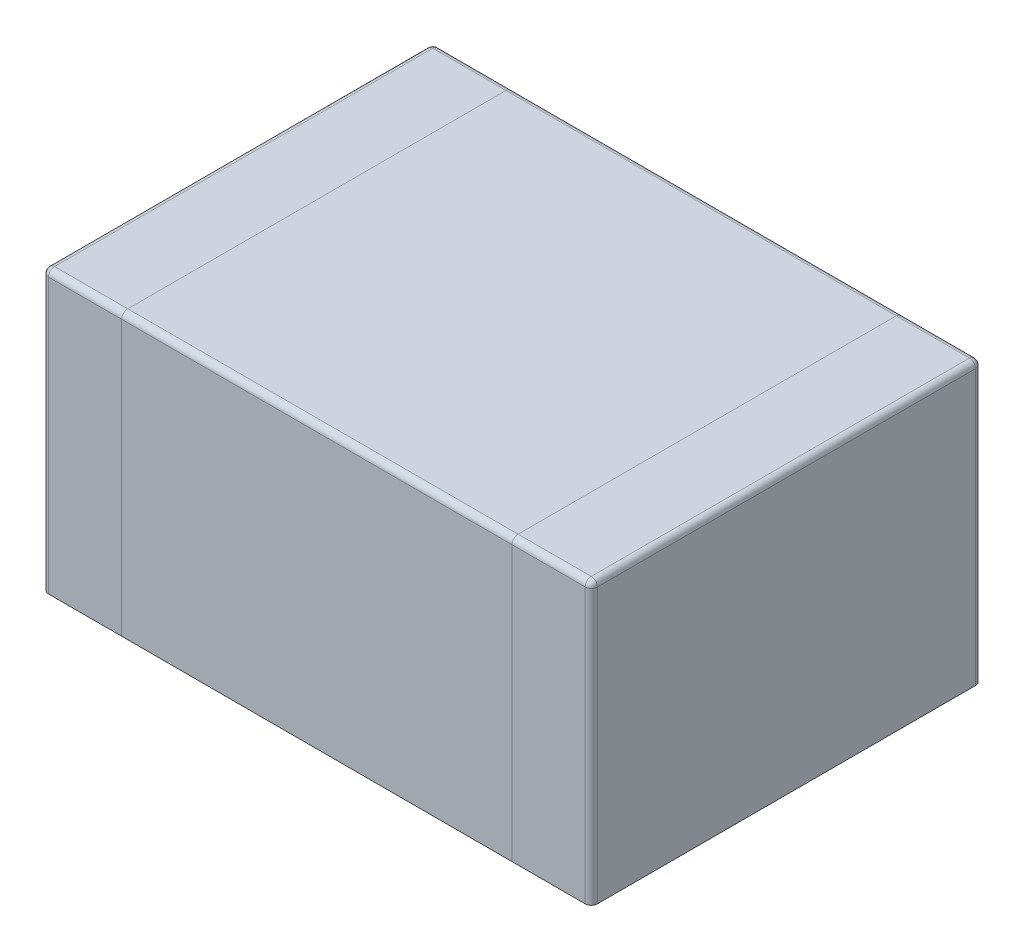
ISO-10303-21;
HEADER;
FILE_DESCRIPTION(('STEP AP214'),'2;1');
FILE_NAME('part.step','',(''),(''),'','','');
FILE_SCHEMA(('AUTOMOTIVE_DESIGN { 1 0 10303 214 1 1 1 1 }'));
ENDSEC;
DATA;
#1=APPLICATION_CONTEXT('core data for automotive mechanical design processes');
#2=APPLICATION_PROTOCOL_DEFINITION('international standard','automotive_design',2000,#1);
#3=PRODUCT_CONTEXT('',#1,'mechanical');
#4=PRODUCT('Part','Part','',(#3));
#5=PRODUCT_RELATED_PRODUCT_CATEGORY('part','',(#4));
#6=PRODUCT_DEFINITION_FORMATION('','',#4);
#7=PRODUCT_DEFINITION_CONTEXT('part definition',#1,'design');
#8=PRODUCT_DEFINITION('design','',#6,#7);
#9=PRODUCT_DEFINITION_SHAPE('','',#8);
#10=(LENGTH_UNIT() NAMED_UNIT(*) SI_UNIT(.MILLI.,.METRE.));
#11=(NAMED_UNIT(*) PLANE_ANGLE_UNIT() SI_UNIT($,.RADIAN.));
#12=(NAMED_UNIT(*) SI_UNIT($,.STERADIAN.) SOLID_ANGLE_UNIT());
#13=UNCERTAINTY_MEASURE_WITH_UNIT(LENGTH_MEASURE(1.E-05),#10,'distance_accuracy_value','');
#14=(GEOMETRIC_REPRESENTATION_CONTEXT(3) GLOBAL_UNCERTAINTY_ASSIGNED_CONTEXT((#13)) GLOBAL_UNIT_ASSIGNED_CONTEXT((#10,
#11,#12)) REPRESENTATION_CONTEXT('',''));
#15=CARTESIAN_POINT('',(0.,0.,0.));
#16=DIRECTION('',(0.,0.,1.));
#17=DIRECTION('',(1.,0.,0.));
#18=AXIS2_PLACEMENT_3D('',#15,#16,#17);
#19=CARTESIAN_POINT('',(-1.6,0.,-1.6));
#20=DIRECTION('',(-1.,0.,0.));
#21=DIRECTION('',(0.,0.,1.));
#22=AXIS2_PLACEMENT_3D('',#19,#20,#21);
#23=PLANE('',#22);
#24=DIRECTION('',(0.,0.,1.));
#25=VECTOR('',#24,1.);
#26=CARTESIAN_POINT('',(-1.6,2.3,-1.6));
#27=LINE('',#26,#25);
#28=CARTESIAN_POINT('',(-1.6,2.3,-1.55));
#29=VERTEX_POINT('',#28);
#30=CARTESIAN_POINT('',(-1.6,2.3,1.55));
#31=VERTEX_POINT('',#30);
#32=EDGE_CURVE('E131',#29,#31,#27,.T.);
#33=ORIENTED_EDGE('',*,*,#32,.F.);
#34=CARTESIAN_POINT('',(-1.6,2.25,-1.55));
#35=DIRECTION('',(-1.,0.,0.));
#36=DIRECTION('',(0.,0.,1.));
#37=AXIS2_PLACEMENT_3D('',#34,#35,#36);
#38=CIRCLE('',#37,0.05);
#39=CARTESIAN_POINT('',(-1.6,2.25,-1.6));
#40=VERTEX_POINT('',#39);
#41=EDGE_CURVE('E150',#29,#40,#38,.T.);
#42=ORIENTED_EDGE('',*,*,#41,.T.);
#43=DIRECTION('',(0.,1.,0.));
#44=VECTOR('',#43,1.);
#45=CARTESIAN_POINT('',(-1.6,0.,-1.6));
#46=LINE('',#45,#44);
#47=CARTESIAN_POINT('',(-1.6,0.,-1.6));
#48=VERTEX_POINT('',#47);
#49=EDGE_CURVE('E127',#48,#40,#46,.T.);
#50=ORIENTED_EDGE('',*,*,#49,.F.);
#51=DIRECTION('',(0.,0.,1.));
#52=VECTOR('',#51,1.);
#53=CARTESIAN_POINT('',(-1.6,0.,-1.6));
#54=LINE('',#53,#52);
#55=CARTESIAN_POINT('',(-1.6,0.,1.6));
#56=VERTEX_POINT('',#55);
#57=EDGE_CURVE('E121',#48,#56,#54,.T.);
#58=ORIENTED_EDGE('',*,*,#57,.T.);
#59=DIRECTION('',(0.,1.,0.));
#60=VECTOR('',#59,1.);
#61=CARTESIAN_POINT('',(-1.6,0.,1.6));
#62=LINE('',#61,#60);
#63=CARTESIAN_POINT('',(-1.6,2.25,1.6));
#64=VERTEX_POINT('',#63);
#65=EDGE_CURVE('E105',#56,#64,#62,.T.);
#66=ORIENTED_EDGE('',*,*,#65,.T.);
#67=CARTESIAN_POINT('',(-1.6,2.25,1.55));
#68=DIRECTION('',(-1.,0.,0.));
#69=DIRECTION('',(0.,0.,1.));
#70=AXIS2_PLACEMENT_3D('',#67,#68,#69);
#71=CIRCLE('',#70,0.05);
#72=EDGE_CURVE('E148',#64,#31,#71,.T.);
#73=ORIENTED_EDGE('',*,*,#72,.T.);
#74=EDGE_LOOP('',(#33,#42,#50,#58,#66,#73));
#75=FACE_BOUND('',#74,.T.);
#76=ADVANCED_FACE('F52',(#75),#23,.T.);
#77=CARTESIAN_POINT('',(-1.6,0.,-1.6));
#78=DIRECTION('',(0.,0.,-1.));
#79=DIRECTION('',(-1.,0.,0.));
#80=AXIS2_PLACEMENT_3D('',#77,#78,#79);
#81=PLANE('',#80);
#82=ORIENTED_EDGE('',*,*,#49,.T.);
#83=DIRECTION('',(-1.,0.,0.));
#84=VECTOR('',#83,1.);
#85=CARTESIAN_POINT('',(-1.6,2.25,-1.6));
#86=LINE('',#85,#84);
#87=CARTESIAN_POINT('',(1.6,2.25,-1.6));
#88=VERTEX_POINT('',#87);
#89=EDGE_CURVE('E75',#40,#88,#86,.F.);
#90=ORIENTED_EDGE('',*,*,#89,.T.);
#91=DIRECTION('',(0.,1.,0.));
#92=VECTOR('',#91,1.);
#93=CARTESIAN_POINT('',(1.6,0.,-1.6));
#94=LINE('',#93,#92);
#95=CARTESIAN_POINT('',(1.6,0.,-1.6));
#96=VERTEX_POINT('',#95);
#97=EDGE_CURVE('E140',#96,#88,#94,.T.);
#98=ORIENTED_EDGE('',*,*,#97,.F.);
#99=DIRECTION('',(-1.,0.,0.));
#100=VECTOR('',#99,1.);
#101=CARTESIAN_POINT('',(-1.6,0.,-1.6));
#102=LINE('',#101,#100);
#103=EDGE_CURVE('E114',#96,#48,#102,.T.);
#104=ORIENTED_EDGE('',*,*,#103,.T.);
#105=EDGE_LOOP('',(#82,#90,#98,#104));
#106=FACE_BOUND('',#105,.T.);
#107=ADVANCED_FACE('F161',(#106),#81,.T.);
#108=CARTESIAN_POINT('',(1.6,0.,-1.6));
#109=DIRECTION('',(1.,0.,0.));
#110=DIRECTION('',(0.,0.,-1.));
#111=AXIS2_PLACEMENT_3D('',#108,#109,#110);
#112=PLANE('',#111);
#113=ORIENTED_EDGE('',*,*,#97,.T.);
#114=CARTESIAN_POINT('',(1.6,2.25,-1.55));
#115=DIRECTION('',(1.,0.,0.));
#116=DIRECTION('',(0.,0.,-1.));
#117=AXIS2_PLACEMENT_3D('',#114,#115,#116);
#118=CIRCLE('',#117,0.05);
#119=CARTESIAN_POINT('',(1.6,2.3,-1.55));
#120=VERTEX_POINT('',#119);
#121=EDGE_CURVE('E60',#88,#120,#118,.T.);
#122=ORIENTED_EDGE('',*,*,#121,.T.);
#123=DIRECTION('',(0.,0.,-1.));
#124=VECTOR('',#123,1.);
#125=CARTESIAN_POINT('',(1.6,2.3,-1.6));
#126=LINE('',#125,#124);
#127=CARTESIAN_POINT('',(1.6,2.3,1.55));
#128=VERTEX_POINT('',#127);
#129=EDGE_CURVE('E128',#128,#120,#126,.T.);
#130=ORIENTED_EDGE('',*,*,#129,.F.);
#131=CARTESIAN_POINT('',(1.6,2.25,1.55));
#132=DIRECTION('',(1.,0.,0.));
#133=DIRECTION('',(0.,0.,-1.));
#134=AXIS2_PLACEMENT_3D('',#131,#132,#133);
#135=CIRCLE('',#134,0.05);
#136=CARTESIAN_POINT('',(1.6,2.25,1.6));
#137=VERTEX_POINT('',#136);
#138=EDGE_CURVE('E67',#128,#137,#135,.T.);
#139=ORIENTED_EDGE('',*,*,#138,.T.);
#140=DIRECTION('',(0.,1.,0.));
#141=VECTOR('',#140,1.);
#142=CARTESIAN_POINT('',(1.6,0.,1.6));
#143=LINE('',#142,#141);
#144=CARTESIAN_POINT('',(1.6,0.,1.6));
#145=VERTEX_POINT('',#144);
#146=EDGE_CURVE('E113',#145,#137,#143,.T.);
#147=ORIENTED_EDGE('',*,*,#146,.F.);
#148=DIRECTION('',(0.,0.,-1.));
#149=VECTOR('',#148,1.);
#150=CARTESIAN_POINT('',(1.6,0.,-1.6));
#151=LINE('',#150,#149);
#152=EDGE_CURVE('E124',#145,#96,#151,.T.);
#153=ORIENTED_EDGE('',*,*,#152,.T.);
#154=EDGE_LOOP('',(#113,#122,#130,#139,#147,#153));
#155=FACE_BOUND('',#154,.T.);
#156=ADVANCED_FACE('F154',(#155),#112,.T.);
#157=CARTESIAN_POINT('',(-1.6,0.,1.6));
#158=DIRECTION('',(0.,0.,1.));
#159=DIRECTION('',(1.,0.,0.));
#160=AXIS2_PLACEMENT_3D('',#157,#158,#159);
#161=PLANE('',#160);
#162=ORIENTED_EDGE('',*,*,#146,.T.);
#163=DIRECTION('',(1.,0.,0.));
#164=VECTOR('',#163,1.);
#165=CARTESIAN_POINT('',(-1.6,2.25,1.6));
#166=LINE('',#165,#164);
#167=EDGE_CURVE('E12',#137,#64,#166,.F.);
#168=ORIENTED_EDGE('',*,*,#167,.T.);
#169=ORIENTED_EDGE('',*,*,#65,.F.);
#170=DIRECTION('',(1.,0.,0.));
#171=VECTOR('',#170,1.);
#172=CARTESIAN_POINT('',(-1.6,0.,1.6));
#173=LINE('',#172,#171);
#174=EDGE_CURVE('E108',#56,#145,#173,.T.);
#175=ORIENTED_EDGE('',*,*,#174,.T.);
#176=EDGE_LOOP('',(#162,#168,#169,#175));
#177=FACE_BOUND('',#176,.T.);
#178=ADVANCED_FACE('F107',(#177),#161,.T.);
#179=CARTESIAN_POINT('',(0.,0.,0.));
#180=DIRECTION('',(0.,1.,0.));
#181=DIRECTION('',(0.,0.,1.));
#182=AXIS2_PLACEMENT_3D('',#179,#180,#181);
#183=PLANE('',#182);
#184=ORIENTED_EDGE('',*,*,#57,.F.);
#185=ORIENTED_EDGE('',*,*,#103,.F.);
#186=ORIENTED_EDGE('',*,*,#152,.F.);
#187=ORIENTED_EDGE('',*,*,#174,.F.);
#188=EDGE_LOOP('',(#184,#185,#186,#187));
#189=FACE_BOUND('',#188,.T.);
#190=ADVANCED_FACE('F119',(#189),#183,.F.);
#191=CARTESIAN_POINT('',(0.,2.3,0.));
#192=DIRECTION('',(0.,1.,0.));
#193=DIRECTION('',(0.,0.,1.));
#194=AXIS2_PLACEMENT_3D('',#191,#192,#193);
#195=PLANE('',#194);
#196=ORIENTED_EDGE('',*,*,#129,.T.);
#197=DIRECTION('',(-1.,0.,0.));
#198=VECTOR('',#197,1.);
#199=CARTESIAN_POINT('',(0.,2.3,-1.55));
#200=LINE('',#199,#198);
#201=EDGE_CURVE('E145',#120,#29,#200,.T.);
#202=ORIENTED_EDGE('',*,*,#201,.T.);
#203=ORIENTED_EDGE('',*,*,#32,.T.);
#204=DIRECTION('',(1.,0.,0.));
#205=VECTOR('',#204,1.);
#206=CARTESIAN_POINT('',(0.,2.3,1.55));
#207=LINE('',#206,#205);
#208=EDGE_CURVE('E139',#31,#128,#207,.T.);
#209=ORIENTED_EDGE('',*,*,#208,.T.);
#210=EDGE_LOOP('',(#196,#202,#203,#209));
#211=FACE_BOUND('',#210,.T.);
#212=ADVANCED_FACE('F158',(#211),#195,.T.);
#213=CARTESIAN_POINT('',(0.,2.25,-1.55));
#214=DIRECTION('',(-1.,0.,0.));
#215=DIRECTION('',(0.,0.,1.));
#216=AXIS2_PLACEMENT_3D('',#213,#214,#215);
#217=CYLINDRICAL_SURFACE('',#216,0.05);
#218=ORIENTED_EDGE('',*,*,#121,.F.);
#219=ORIENTED_EDGE('',*,*,#89,.F.);
#220=ORIENTED_EDGE('',*,*,#41,.F.);
#221=ORIENTED_EDGE('',*,*,#201,.F.);
#222=EDGE_LOOP('',(#218,#219,#220,#221));
#223=FACE_BOUND('',#222,.T.);
#224=ADVANCED_FACE('F160',(#223),#217,.T.);
#225=CARTESIAN_POINT('',(0.,2.25,1.55));
#226=DIRECTION('',(1.,0.,0.));
#227=DIRECTION('',(0.,0.,-1.));
#228=AXIS2_PLACEMENT_3D('',#225,#226,#227);
#229=CYLINDRICAL_SURFACE('',#228,0.05);
#230=ORIENTED_EDGE('',*,*,#72,.F.);
#231=ORIENTED_EDGE('',*,*,#167,.F.);
#232=ORIENTED_EDGE('',*,*,#138,.F.);
#233=ORIENTED_EDGE('',*,*,#208,.F.);
#234=EDGE_LOOP('',(#230,#231,#232,#233));
#235=FACE_BOUND('',#234,.T.);
#236=ADVANCED_FACE('F54',(#235),#229,.T.);
#237=CLOSED_SHELL('',(#76,#107,#156,#178,#190,#212,#224,#236));
#238=MANIFOLD_SOLID_BREP('B2',#237);
#239=CARTESIAN_POINT('',(0.,2.3,-1.6));
#240=DIRECTION('',(0.,0.,1.));
#241=DIRECTION('',(1.,0.,0.));
#242=AXIS2_PLACEMENT_3D('',#239,#240,#241);
#243=PLANE('',#242);
#244=DIRECTION('',(0.,-1.,0.));
#245=VECTOR('',#244,1.);
#246=CARTESIAN_POINT('',(1.6,2.3,-1.6));
#247=LINE('',#246,#245);
#248=CARTESIAN_POINT('',(1.6,2.25,-1.6));
#249=VERTEX_POINT('',#248);
#250=CARTESIAN_POINT('',(1.6,0.,-1.6));
#251=VERTEX_POINT('',#250);
#252=EDGE_CURVE('E304',#249,#251,#247,.T.);
#253=ORIENTED_EDGE('',*,*,#252,.F.);
#254=DIRECTION('',(-1.,0.,0.));
#255=VECTOR('',#254,1.);
#256=CARTESIAN_POINT('',(2.25,2.25,-1.6));
#257=LINE('',#256,#255);
#258=CARTESIAN_POINT('',(2.2,2.25,-1.6));
#259=VERTEX_POINT('',#258);
#260=EDGE_CURVE('E345',#249,#259,#257,.F.);
#261=ORIENTED_EDGE('',*,*,#260,.T.);
#262=DIRECTION('',(0.,-1.,0.));
#263=VECTOR('',#262,1.);
#264=CARTESIAN_POINT('',(2.2,0.,-1.6));
#265=LINE('',#264,#263);
#266=CARTESIAN_POINT('',(2.2,0.,-1.6));
#267=VERTEX_POINT('',#266);
#268=EDGE_CURVE('E307',#259,#267,#265,.T.);
#269=ORIENTED_EDGE('',*,*,#268,.T.);
#270=DIRECTION('',(-1.,0.,0.));
#271=VECTOR('',#270,1.);
#272=CARTESIAN_POINT('',(0.,0.,-1.6));
#273=LINE('',#272,#271);
#274=EDGE_CURVE('E302',#267,#251,#273,.T.);
#275=ORIENTED_EDGE('',*,*,#274,.T.);
#276=EDGE_LOOP('',(#253,#261,#269,#275));
#277=FACE_BOUND('',#276,.T.);
#278=ADVANCED_FACE('F237',(#277),#243,.F.);
#279=CARTESIAN_POINT('',(1.6,2.3,0.));
#280=DIRECTION('',(1.,0.,0.));
#281=DIRECTION('',(0.,0.,-1.));
#282=AXIS2_PLACEMENT_3D('',#279,#280,#281);
#283=PLANE('',#282);
#284=DIRECTION('',(0.,0.,1.));
#285=VECTOR('',#284,1.);
#286=CARTESIAN_POINT('',(1.6,2.3,0.));
#287=LINE('',#286,#285);
#288=CARTESIAN_POINT('',(1.6,2.3,-1.55));
#289=VERTEX_POINT('',#288);
#290=CARTESIAN_POINT('',(1.6,2.3,1.55));
#291=VERTEX_POINT('',#290);
#292=EDGE_CURVE('E333',#289,#291,#287,.T.);
#293=ORIENTED_EDGE('',*,*,#292,.F.);
#294=CARTESIAN_POINT('',(1.6,2.25,-1.55));
#295=DIRECTION('',(1.,0.,0.));
#296=DIRECTION('',(0.,0.,-1.));
#297=AXIS2_PLACEMENT_3D('',#294,#295,#296);
#298=CIRCLE('',#297,0.05);
#299=EDGE_CURVE('E318',#289,#249,#298,.F.);
#300=ORIENTED_EDGE('',*,*,#299,.T.);
#301=ORIENTED_EDGE('',*,*,#252,.T.);
#302=DIRECTION('',(0.,0.,1.));
#303=VECTOR('',#302,1.);
#304=CARTESIAN_POINT('',(1.6,0.,0.));
#305=LINE('',#304,#303);
#306=CARTESIAN_POINT('',(1.6,0.,1.6));
#307=VERTEX_POINT('',#306);
#308=EDGE_CURVE('E311',#251,#307,#305,.T.);
#309=ORIENTED_EDGE('',*,*,#308,.T.);
#310=DIRECTION('',(0.,-1.,0.));
#311=VECTOR('',#310,1.);
#312=CARTESIAN_POINT('',(1.6,2.3,1.6));
#313=LINE('',#312,#311);
#314=CARTESIAN_POINT('',(1.6,2.25,1.6));
#315=VERTEX_POINT('',#314);
#316=EDGE_CURVE('E320',#315,#307,#313,.T.);
#317=ORIENTED_EDGE('',*,*,#316,.F.);
#318=CARTESIAN_POINT('',(1.6,2.25,1.55));
#319=DIRECTION('',(1.,0.,0.));
#320=DIRECTION('',(0.,0.,-1.));
#321=AXIS2_PLACEMENT_3D('',#318,#319,#320);
#322=CIRCLE('',#321,0.05);
#323=EDGE_CURVE('E341',#315,#291,#322,.F.);
#324=ORIENTED_EDGE('',*,*,#323,.T.);
#325=EDGE_LOOP('',(#293,#300,#301,#309,#317,#324));
#326=FACE_BOUND('',#325,.T.);
#327=ADVANCED_FACE('F316',(#326),#283,.F.);
#328=CARTESIAN_POINT('',(0.,2.3,1.6));
#329=DIRECTION('',(0.,0.,1.));
#330=DIRECTION('',(1.,0.,0.));
#331=AXIS2_PLACEMENT_3D('',#328,#329,#330);
#332=PLANE('',#331);
#333=DIRECTION('',(0.,-1.,0.));
#334=VECTOR('',#333,1.);
#335=CARTESIAN_POINT('',(2.2,2.3,1.6));
#336=LINE('',#335,#334);
#337=CARTESIAN_POINT('',(2.2,0.,1.6));
#338=VERTEX_POINT('',#337);
#339=CARTESIAN_POINT('',(2.2,2.25,1.6));
#340=VERTEX_POINT('',#339);
#341=EDGE_CURVE('E347',#338,#340,#336,.F.);
#342=ORIENTED_EDGE('',*,*,#341,.T.);
#343=DIRECTION('',(-1.,0.,0.));
#344=VECTOR('',#343,1.);
#345=CARTESIAN_POINT('',(0.,2.25,1.6));
#346=LINE('',#345,#344);
#347=EDGE_CURVE('E349',#340,#315,#346,.T.);
#348=ORIENTED_EDGE('',*,*,#347,.T.);
#349=ORIENTED_EDGE('',*,*,#316,.T.);
#350=DIRECTION('',(-1.,0.,0.));
#351=VECTOR('',#350,1.);
#352=CARTESIAN_POINT('',(0.,0.,1.6));
#353=LINE('',#352,#351);
#354=EDGE_CURVE('E325',#338,#307,#353,.T.);
#355=ORIENTED_EDGE('',*,*,#354,.F.);
#356=EDGE_LOOP('',(#342,#348,#349,#355));
#357=FACE_BOUND('',#356,.T.);
#358=ADVANCED_FACE('F393',(#357),#332,.T.);
#359=CARTESIAN_POINT('',(2.25,2.3,0.));
#360=DIRECTION('',(1.,0.,0.));
#361=DIRECTION('',(0.,0.,-1.));
#362=AXIS2_PLACEMENT_3D('',#359,#360,#361);
#363=PLANE('',#362);
#364=DIRECTION('',(0.,0.,1.));
#365=VECTOR('',#364,1.);
#366=CARTESIAN_POINT('',(2.25,2.25,0.));
#367=LINE('',#366,#365);
#368=CARTESIAN_POINT('',(2.25,2.25,-1.55));
#369=VERTEX_POINT('',#368);
#370=CARTESIAN_POINT('',(2.25,2.25,1.55));
#371=VERTEX_POINT('',#370);
#372=EDGE_CURVE('E254',#369,#371,#367,.T.);
#373=ORIENTED_EDGE('',*,*,#372,.T.);
#374=DIRECTION('',(0.,-1.,0.));
#375=VECTOR('',#374,1.);
#376=CARTESIAN_POINT('',(2.25,2.3,1.55));
#377=LINE('',#376,#375);
#378=CARTESIAN_POINT('',(2.25,0.,1.55));
#379=VERTEX_POINT('',#378);
#380=EDGE_CURVE('E353',#371,#379,#377,.T.);
#381=ORIENTED_EDGE('',*,*,#380,.T.);
#382=DIRECTION('',(0.,0.,1.));
#383=VECTOR('',#382,1.);
#384=CARTESIAN_POINT('',(2.25,0.,0.));
#385=LINE('',#384,#383);
#386=CARTESIAN_POINT('',(2.25,0.,-1.55));
#387=VERTEX_POINT('',#386);
#388=EDGE_CURVE('E328',#387,#379,#385,.T.);
#389=ORIENTED_EDGE('',*,*,#388,.F.);
#390=DIRECTION('',(0.,-1.,0.));
#391=VECTOR('',#390,1.);
#392=CARTESIAN_POINT('',(2.25,2.3,-1.55));
#393=LINE('',#392,#391);
#394=EDGE_CURVE('E259',#387,#369,#393,.F.);
#395=ORIENTED_EDGE('',*,*,#394,.T.);
#396=EDGE_LOOP('',(#373,#381,#389,#395));
#397=FACE_BOUND('',#396,.T.);
#398=ADVANCED_FACE('F395',(#397),#363,.T.);
#399=CARTESIAN_POINT('',(0.,2.3,0.));
#400=DIRECTION('',(0.,1.,0.));
#401=DIRECTION('',(0.,0.,1.));
#402=AXIS2_PLACEMENT_3D('',#399,#400,#401);
#403=PLANE('',#402);
#404=DIRECTION('',(0.,0.,1.));
#405=VECTOR('',#404,1.);
#406=CARTESIAN_POINT('',(2.2,2.3,0.));
#407=LINE('',#406,#405);
#408=CARTESIAN_POINT('',(2.2,2.3,1.55));
#409=VERTEX_POINT('',#408);
#410=CARTESIAN_POINT('',(2.2,2.3,-1.55));
#411=VERTEX_POINT('',#410);
#412=EDGE_CURVE('E319',#409,#411,#407,.F.);
#413=ORIENTED_EDGE('',*,*,#412,.T.);
#414=DIRECTION('',(-1.,0.,0.));
#415=VECTOR('',#414,1.);
#416=CARTESIAN_POINT('',(1.6,2.3,-1.55));
#417=LINE('',#416,#415);
#418=EDGE_CURVE('E338',#411,#289,#417,.T.);
#419=ORIENTED_EDGE('',*,*,#418,.T.);
#420=ORIENTED_EDGE('',*,*,#292,.T.);
#421=DIRECTION('',(-1.,0.,0.));
#422=VECTOR('',#421,1.);
#423=CARTESIAN_POINT('',(0.,2.3,1.55));
#424=LINE('',#423,#422);
#425=EDGE_CURVE('E336',#291,#409,#424,.F.);
#426=ORIENTED_EDGE('',*,*,#425,.T.);
#427=EDGE_LOOP('',(#413,#419,#420,#426));
#428=FACE_BOUND('',#427,.T.);
#429=ADVANCED_FACE('F384',(#428),#403,.T.);
#430=CARTESIAN_POINT('',(0.,0.,0.));
#431=DIRECTION('',(0.,1.,0.));
#432=DIRECTION('',(0.,0.,1.));
#433=AXIS2_PLACEMENT_3D('',#430,#431,#432);
#434=PLANE('',#433);
#435=ORIENTED_EDGE('',*,*,#388,.T.);
#436=CARTESIAN_POINT('',(2.2,0.,1.55));
#437=DIRECTION('',(0.,1.,0.));
#438=DIRECTION('',(0.,0.,1.));
#439=AXIS2_PLACEMENT_3D('',#436,#437,#438);
#440=CIRCLE('',#439,0.05);
#441=EDGE_CURVE('E50',#379,#338,#440,.F.);
#442=ORIENTED_EDGE('',*,*,#441,.T.);
#443=ORIENTED_EDGE('',*,*,#354,.T.);
#444=ORIENTED_EDGE('',*,*,#308,.F.);
#445=ORIENTED_EDGE('',*,*,#274,.F.);
#446=CARTESIAN_POINT('',(2.2,0.,-1.55));
#447=DIRECTION('',(0.,1.,0.));
#448=DIRECTION('',(0.,0.,1.));
#449=AXIS2_PLACEMENT_3D('',#446,#447,#448);
#450=CIRCLE('',#449,0.05);
#451=EDGE_CURVE('E246',#267,#387,#450,.F.);
#452=ORIENTED_EDGE('',*,*,#451,.T.);
#453=EDGE_LOOP('',(#435,#442,#443,#444,#445,#452));
#454=FACE_BOUND('',#453,.T.);
#455=ADVANCED_FACE('F323',(#454),#434,.F.);
#456=CARTESIAN_POINT('',(2.2,2.3,1.55));
#457=DIRECTION('',(0.,-1.,0.));
#458=DIRECTION('',(0.,0.,-1.));
#459=AXIS2_PLACEMENT_3D('',#456,#457,#458);
#460=CYLINDRICAL_SURFACE('',#459,0.05);
#461=ORIENTED_EDGE('',*,*,#441,.F.);
#462=ORIENTED_EDGE('',*,*,#380,.F.);
#463=CARTESIAN_POINT('',(2.2,2.25,1.55));
#464=DIRECTION('',(0.,1.,0.));
#465=DIRECTION('',(0.,0.,1.));
#466=AXIS2_PLACEMENT_3D('',#463,#464,#465);
#467=CIRCLE('',#466,0.05);
#468=EDGE_CURVE('E241',#340,#371,#467,.T.);
#469=ORIENTED_EDGE('',*,*,#468,.F.);
#470=ORIENTED_EDGE('',*,*,#341,.F.);
#471=EDGE_LOOP('',(#461,#462,#469,#470));
#472=FACE_BOUND('',#471,.T.);
#473=ADVANCED_FACE('F239',(#472),#460,.T.);
#474=CARTESIAN_POINT('',(0.,2.25,1.55));
#475=DIRECTION('',(-1.,0.,0.));
#476=DIRECTION('',(0.,0.,1.));
#477=AXIS2_PLACEMENT_3D('',#474,#475,#476);
#478=CYLINDRICAL_SURFACE('',#477,0.05);
#479=ORIENTED_EDGE('',*,*,#323,.F.);
#480=ORIENTED_EDGE('',*,*,#347,.F.);
#481=CARTESIAN_POINT('',(2.2,2.25,1.55));
#482=DIRECTION('',(1.,0.,0.));
#483=DIRECTION('',(0.,0.,-1.));
#484=AXIS2_PLACEMENT_3D('',#481,#482,#483);
#485=CIRCLE('',#484,0.05);
#486=EDGE_CURVE('E367',#409,#340,#485,.T.);
#487=ORIENTED_EDGE('',*,*,#486,.F.);
#488=ORIENTED_EDGE('',*,*,#425,.F.);
#489=EDGE_LOOP('',(#479,#480,#487,#488));
#490=FACE_BOUND('',#489,.T.);
#491=ADVANCED_FACE('F391',(#490),#478,.T.);
#492=CARTESIAN_POINT('',(2.2,2.25,1.55));
#493=DIRECTION('',(0.,0.,1.));
#494=DIRECTION('',(1.,0.,0.));
#495=AXIS2_PLACEMENT_3D('',#492,#493,#494);
#496=SPHERICAL_SURFACE('',#495,0.05);
#497=ORIENTED_EDGE('',*,*,#486,.T.);
#498=ORIENTED_EDGE('',*,*,#468,.T.);
#499=CARTESIAN_POINT('',(2.2,2.25,1.55));
#500=DIRECTION('',(0.,0.,1.));
#501=DIRECTION('',(1.,0.,0.));
#502=AXIS2_PLACEMENT_3D('',#499,#500,#501);
#503=CIRCLE('',#502,0.05);
#504=EDGE_CURVE('E365',#409,#371,#503,.F.);
#505=ORIENTED_EDGE('',*,*,#504,.F.);
#506=EDGE_LOOP('',(#497,#498,#505));
#507=FACE_BOUND('',#506,.T.);
#508=ADVANCED_FACE('F374',(#507),#496,.T.);
#509=CARTESIAN_POINT('',(2.2,2.3,-1.55));
#510=DIRECTION('',(0.,1.,0.));
#511=DIRECTION('',(0.,0.,1.));
#512=AXIS2_PLACEMENT_3D('',#509,#510,#511);
#513=CYLINDRICAL_SURFACE('',#512,0.05);
#514=ORIENTED_EDGE('',*,*,#451,.F.);
#515=ORIENTED_EDGE('',*,*,#268,.F.);
#516=CARTESIAN_POINT('',(2.2,2.25,-1.55));
#517=DIRECTION('',(0.,1.,0.));
#518=DIRECTION('',(0.,0.,1.));
#519=AXIS2_PLACEMENT_3D('',#516,#517,#518);
#520=CIRCLE('',#519,0.05);
#521=EDGE_CURVE('E362',#369,#259,#520,.T.);
#522=ORIENTED_EDGE('',*,*,#521,.F.);
#523=ORIENTED_EDGE('',*,*,#394,.F.);
#524=EDGE_LOOP('',(#514,#515,#522,#523));
#525=FACE_BOUND('',#524,.T.);
#526=ADVANCED_FACE('F397',(#525),#513,.T.);
#527=CARTESIAN_POINT('',(2.2,2.25,0.));
#528=DIRECTION('',(0.,0.,1.));
#529=DIRECTION('',(1.,0.,0.));
#530=AXIS2_PLACEMENT_3D('',#527,#528,#529);
#531=CYLINDRICAL_SURFACE('',#530,0.05);
#532=ORIENTED_EDGE('',*,*,#504,.T.);
#533=ORIENTED_EDGE('',*,*,#372,.F.);
#534=CARTESIAN_POINT('',(2.2,2.25,-1.55));
#535=DIRECTION('',(0.,0.,-1.));
#536=DIRECTION('',(-1.,0.,0.));
#537=AXIS2_PLACEMENT_3D('',#534,#535,#536);
#538=CIRCLE('',#537,0.05);
#539=EDGE_CURVE('E359',#411,#369,#538,.T.);
#540=ORIENTED_EDGE('',*,*,#539,.F.);
#541=ORIENTED_EDGE('',*,*,#412,.F.);
#542=EDGE_LOOP('',(#532,#533,#540,#541));
#543=FACE_BOUND('',#542,.T.);
#544=ADVANCED_FACE('F379',(#543),#531,.T.);
#545=CARTESIAN_POINT('',(2.2,2.25,-1.55));
#546=DIRECTION('',(0.,0.,1.));
#547=DIRECTION('',(1.,0.,0.));
#548=AXIS2_PLACEMENT_3D('',#545,#546,#547);
#549=SPHERICAL_SURFACE('',#548,0.05);
#550=ORIENTED_EDGE('',*,*,#539,.T.);
#551=ORIENTED_EDGE('',*,*,#521,.T.);
#552=CARTESIAN_POINT('',(2.2,2.25,-1.55));
#553=DIRECTION('',(1.,0.,0.));
#554=DIRECTION('',(0.,1.,0.));
#555=AXIS2_PLACEMENT_3D('',#552,#553,#554);
#556=CIRCLE('',#555,0.05);
#557=EDGE_CURVE('E356',#411,#259,#556,.F.);
#558=ORIENTED_EDGE('',*,*,#557,.F.);
#559=EDGE_LOOP('',(#550,#551,#558));
#560=FACE_BOUND('',#559,.T.);
#561=ADVANCED_FACE('F399',(#560),#549,.T.);
#562=CARTESIAN_POINT('',(0.,2.25,-1.55));
#563=DIRECTION('',(1.,0.,0.));
#564=DIRECTION('',(0.,0.,-1.));
#565=AXIS2_PLACEMENT_3D('',#562,#563,#564);
#566=CYLINDRICAL_SURFACE('',#565,0.05);
#567=ORIENTED_EDGE('',*,*,#557,.T.);
#568=ORIENTED_EDGE('',*,*,#260,.F.);
#569=ORIENTED_EDGE('',*,*,#299,.F.);
#570=ORIENTED_EDGE('',*,*,#418,.F.);
#571=EDGE_LOOP('',(#567,#568,#569,#570));
#572=FACE_BOUND('',#571,.T.);
#573=ADVANCED_FACE('F401',(#572),#566,.T.);
#574=CLOSED_SHELL('',(#278,#327,#358,#398,#429,#455,#473,#491,#508,#526,#544,#561,#573));
#575=MANIFOLD_SOLID_BREP('B6',#574);
#576=CARTESIAN_POINT('',(-1.6,2.3,0.));
#577=DIRECTION('',(1.,0.,0.));
#578=DIRECTION('',(0.,0.,-1.));
#579=AXIS2_PLACEMENT_3D('',#576,#577,#578);
#580=PLANE('',#579);
#581=DIRECTION('',(0.,-1.,0.));
#582=VECTOR('',#581,1.);
#583=CARTESIAN_POINT('',(-1.6,2.3,-1.6));
#584=LINE('',#583,#582);
#585=CARTESIAN_POINT('',(-1.6,2.25,-1.6));
#586=VERTEX_POINT('',#585);
#587=CARTESIAN_POINT('',(-1.6,0.,-1.6));
#588=VERTEX_POINT('',#587);
#589=EDGE_CURVE('E592',#586,#588,#584,.T.);
#590=ORIENTED_EDGE('',*,*,#589,.F.);
#591=CARTESIAN_POINT('',(-1.6,2.25,-1.55));
#592=DIRECTION('',(1.,0.,0.));
#593=DIRECTION('',(0.,0.,-1.));
#594=AXIS2_PLACEMENT_3D('',#591,#592,#593);
#595=CIRCLE('',#594,0.05);
#596=CARTESIAN_POINT('',(-1.6,2.3,-1.55));
#597=VERTEX_POINT('',#596);
#598=EDGE_CURVE('E631',#586,#597,#595,.T.);
#599=ORIENTED_EDGE('',*,*,#598,.T.);
#600=DIRECTION('',(0.,0.,1.));
#601=VECTOR('',#600,1.);
#602=CARTESIAN_POINT('',(-1.6,2.3,0.));
#603=LINE('',#602,#601);
#604=CARTESIAN_POINT('',(-1.6,2.3,1.55));
#605=VERTEX_POINT('',#604);
#606=EDGE_CURVE('E615',#597,#605,#603,.T.);
#607=ORIENTED_EDGE('',*,*,#606,.T.);
#608=CARTESIAN_POINT('',(-1.6,2.25,1.55));
#609=DIRECTION('',(1.,0.,0.));
#610=DIRECTION('',(0.,0.,-1.));
#611=AXIS2_PLACEMENT_3D('',#608,#609,#610);
#612=CIRCLE('',#611,0.05);
#613=CARTESIAN_POINT('',(-1.6,2.25,1.6));
#614=VERTEX_POINT('',#613);
#615=EDGE_CURVE('E629',#605,#614,#612,.T.);
#616=ORIENTED_EDGE('',*,*,#615,.T.);
#617=DIRECTION('',(0.,-1.,0.));
#618=VECTOR('',#617,1.);
#619=CARTESIAN_POINT('',(-1.6,2.3,1.6));
#620=LINE('',#619,#618);
#621=CARTESIAN_POINT('',(-1.6,0.,1.6));
#622=VERTEX_POINT('',#621);
#623=EDGE_CURVE('E602',#614,#622,#620,.T.);
#624=ORIENTED_EDGE('',*,*,#623,.T.);
#625=DIRECTION('',(0.,0.,1.));
#626=VECTOR('',#625,1.);
#627=CARTESIAN_POINT('',(-1.6,0.,0.));
#628=LINE('',#627,#626);
#629=EDGE_CURVE('E606',#588,#622,#628,.T.);
#630=ORIENTED_EDGE('',*,*,#629,.F.);
#631=EDGE_LOOP('',(#590,#599,#607,#616,#624,#630));
#632=FACE_BOUND('',#631,.T.);
#633=ADVANCED_FACE('F525',(#632),#580,.T.);
#634=CARTESIAN_POINT('',(0.,2.3,-1.6));
#635=DIRECTION('',(0.,0.,1.));
#636=DIRECTION('',(1.,0.,0.));
#637=AXIS2_PLACEMENT_3D('',#634,#635,#636);
#638=PLANE('',#637);
#639=DIRECTION('',(-1.,0.,0.));
#640=VECTOR('',#639,1.);
#641=CARTESIAN_POINT('',(0.,0.,-1.6));
#642=LINE('',#641,#640);
#643=CARTESIAN_POINT('',(-2.2,0.,-1.6));
#644=VERTEX_POINT('',#643);
#645=EDGE_CURVE('E594',#588,#644,#642,.T.);
#646=ORIENTED_EDGE('',*,*,#645,.T.);
#647=DIRECTION('',(0.,-1.,0.));
#648=VECTOR('',#647,1.);
#649=CARTESIAN_POINT('',(-2.2,2.3,-1.6));
#650=LINE('',#649,#648);
#651=CARTESIAN_POINT('',(-2.2,2.25,-1.6));
#652=VERTEX_POINT('',#651);
#653=EDGE_CURVE('E235',#644,#652,#650,.F.);
#654=ORIENTED_EDGE('',*,*,#653,.T.);
#655=DIRECTION('',(-1.,0.,0.));
#656=VECTOR('',#655,1.);
#657=CARTESIAN_POINT('',(-1.6,2.25,-1.6));
#658=LINE('',#657,#656);
#659=EDGE_CURVE('E597',#652,#586,#658,.F.);
#660=ORIENTED_EDGE('',*,*,#659,.T.);
#661=ORIENTED_EDGE('',*,*,#589,.T.);
#662=EDGE_LOOP('',(#646,#654,#660,#661));
#663=FACE_BOUND('',#662,.T.);
#664=ADVANCED_FACE('F593',(#663),#638,.F.);
#665=CARTESIAN_POINT('',(-2.25,2.3,0.));
#666=DIRECTION('',(1.,0.,0.));
#667=DIRECTION('',(0.,0.,-1.));
#668=AXIS2_PLACEMENT_3D('',#665,#666,#667);
#669=PLANE('',#668);
#670=DIRECTION('',(0.,0.,1.));
#671=VECTOR('',#670,1.);
#672=CARTESIAN_POINT('',(-2.25,0.,0.));
#673=LINE('',#672,#671);
#674=CARTESIAN_POINT('',(-2.25,0.,-1.55));
#675=VERTEX_POINT('',#674);
#676=CARTESIAN_POINT('',(-2.25,0.,1.55));
#677=VERTEX_POINT('',#676);
#678=EDGE_CURVE('E608',#675,#677,#673,.T.);
#679=ORIENTED_EDGE('',*,*,#678,.T.);
#680=DIRECTION('',(0.,-1.,0.));
#681=VECTOR('',#680,1.);
#682=CARTESIAN_POINT('',(-2.25,2.25,1.55));
#683=LINE('',#682,#681);
#684=CARTESIAN_POINT('',(-2.25,2.25,1.55));
#685=VERTEX_POINT('',#684);
#686=EDGE_CURVE('E534',#677,#685,#683,.F.);
#687=ORIENTED_EDGE('',*,*,#686,.T.);
#688=DIRECTION('',(0.,0.,1.));
#689=VECTOR('',#688,1.);
#690=CARTESIAN_POINT('',(-2.25,2.25,-1.6));
#691=LINE('',#690,#689);
#692=CARTESIAN_POINT('',(-2.25,2.25,-1.55));
#693=VERTEX_POINT('',#692);
#694=EDGE_CURVE('E636',#685,#693,#691,.F.);
#695=ORIENTED_EDGE('',*,*,#694,.T.);
#696=DIRECTION('',(0.,-1.,0.));
#697=VECTOR('',#696,1.);
#698=CARTESIAN_POINT('',(-2.25,2.3,-1.55));
#699=LINE('',#698,#697);
#700=EDGE_CURVE('E653',#693,#675,#699,.T.);
#701=ORIENTED_EDGE('',*,*,#700,.T.);
#702=EDGE_LOOP('',(#679,#687,#695,#701));
#703=FACE_BOUND('',#702,.T.);
#704=ADVANCED_FACE('F658',(#703),#669,.F.);
#705=CARTESIAN_POINT('',(0.,2.3,1.6));
#706=DIRECTION('',(0.,0.,1.));
#707=DIRECTION('',(1.,0.,0.));
#708=AXIS2_PLACEMENT_3D('',#705,#706,#707);
#709=PLANE('',#708);
#710=DIRECTION('',(-1.,0.,0.));
#711=VECTOR('',#710,1.);
#712=CARTESIAN_POINT('',(0.,2.25,1.6));
#713=LINE('',#712,#711);
#714=CARTESIAN_POINT('',(-2.2,2.25,1.6));
#715=VERTEX_POINT('',#714);
#716=EDGE_CURVE('E633',#614,#715,#713,.T.);
#717=ORIENTED_EDGE('',*,*,#716,.T.);
#718=DIRECTION('',(0.,-1.,0.));
#719=VECTOR('',#718,1.);
#720=CARTESIAN_POINT('',(-2.2,0.,1.6));
#721=LINE('',#720,#719);
#722=CARTESIAN_POINT('',(-2.2,0.,1.6));
#723=VERTEX_POINT('',#722);
#724=EDGE_CURVE('E649',#715,#723,#721,.T.);
#725=ORIENTED_EDGE('',*,*,#724,.T.);
#726=DIRECTION('',(-1.,0.,0.));
#727=VECTOR('',#726,1.);
#728=CARTESIAN_POINT('',(0.,0.,1.6));
#729=LINE('',#728,#727);
#730=EDGE_CURVE('E618',#622,#723,#729,.T.);
#731=ORIENTED_EDGE('',*,*,#730,.F.);
#732=ORIENTED_EDGE('',*,*,#623,.F.);
#733=EDGE_LOOP('',(#717,#725,#731,#732));
#734=FACE_BOUND('',#733,.T.);
#735=ADVANCED_FACE('F676',(#734),#709,.T.);
#736=CARTESIAN_POINT('',(0.,2.3,0.));
#737=DIRECTION('',(0.,1.,0.));
#738=DIRECTION('',(0.,0.,1.));
#739=AXIS2_PLACEMENT_3D('',#736,#737,#738);
#740=PLANE('',#739);
#741=ORIENTED_EDGE('',*,*,#606,.F.);
#742=DIRECTION('',(-1.,0.,0.));
#743=VECTOR('',#742,1.);
#744=CARTESIAN_POINT('',(-2.25,2.3,-1.55));
#745=LINE('',#744,#743);
#746=CARTESIAN_POINT('',(-2.2,2.3,-1.55));
#747=VERTEX_POINT('',#746);
#748=EDGE_CURVE('E625',#597,#747,#745,.T.);
#749=ORIENTED_EDGE('',*,*,#748,.T.);
#750=DIRECTION('',(0.,0.,1.));
#751=VECTOR('',#750,1.);
#752=CARTESIAN_POINT('',(-2.2,2.3,1.6));
#753=LINE('',#752,#751);
#754=CARTESIAN_POINT('',(-2.2,2.3,1.55));
#755=VERTEX_POINT('',#754);
#756=EDGE_CURVE('E601',#747,#755,#753,.T.);
#757=ORIENTED_EDGE('',*,*,#756,.T.);
#758=DIRECTION('',(-1.,0.,0.));
#759=VECTOR('',#758,1.);
#760=CARTESIAN_POINT('',(0.,2.3,1.55));
#761=LINE('',#760,#759);
#762=EDGE_CURVE('E623',#755,#605,#761,.F.);
#763=ORIENTED_EDGE('',*,*,#762,.T.);
#764=EDGE_LOOP('',(#741,#749,#757,#763));
#765=FACE_BOUND('',#764,.T.);
#766=ADVANCED_FACE('F678',(#765),#740,.T.);
#767=CARTESIAN_POINT('',(0.,0.,0.));
#768=DIRECTION('',(0.,1.,0.));
#769=DIRECTION('',(0.,0.,1.));
#770=AXIS2_PLACEMENT_3D('',#767,#768,#769);
#771=PLANE('',#770);
#772=ORIENTED_EDGE('',*,*,#730,.T.);
#773=CARTESIAN_POINT('',(-2.2,0.,1.55));
#774=DIRECTION('',(0.,1.,0.));
#775=DIRECTION('',(0.,0.,1.));
#776=AXIS2_PLACEMENT_3D('',#773,#774,#775);
#777=CIRCLE('',#776,0.05);
#778=EDGE_CURVE('E548',#723,#677,#777,.F.);
#779=ORIENTED_EDGE('',*,*,#778,.T.);
#780=ORIENTED_EDGE('',*,*,#678,.F.);
#781=CARTESIAN_POINT('',(-2.2,0.,-1.55));
#782=DIRECTION('',(0.,1.,0.));
#783=DIRECTION('',(0.,0.,1.));
#784=AXIS2_PLACEMENT_3D('',#781,#782,#783);
#785=CIRCLE('',#784,0.05);
#786=EDGE_CURVE('E542',#675,#644,#785,.F.);
#787=ORIENTED_EDGE('',*,*,#786,.T.);
#788=ORIENTED_EDGE('',*,*,#645,.F.);
#789=ORIENTED_EDGE('',*,*,#629,.T.);
#790=EDGE_LOOP('',(#772,#779,#780,#787,#788,#789));
#791=FACE_BOUND('',#790,.T.);
#792=ADVANCED_FACE('F605',(#791),#771,.F.);
#793=CARTESIAN_POINT('',(0.,2.25,1.55));
#794=DIRECTION('',(-1.,0.,0.));
#795=DIRECTION('',(0.,0.,1.));
#796=AXIS2_PLACEMENT_3D('',#793,#794,#795);
#797=CYLINDRICAL_SURFACE('',#796,0.05);
#798=ORIENTED_EDGE('',*,*,#762,.F.);
#799=CARTESIAN_POINT('',(-2.2,2.25,1.55));
#800=DIRECTION('',(-1.,0.,0.));
#801=DIRECTION('',(0.,0.,1.));
#802=AXIS2_PLACEMENT_3D('',#799,#800,#801);
#803=CIRCLE('',#802,0.05);
#804=EDGE_CURVE('E644',#755,#715,#803,.F.);
#805=ORIENTED_EDGE('',*,*,#804,.T.);
#806=ORIENTED_EDGE('',*,*,#716,.F.);
#807=ORIENTED_EDGE('',*,*,#615,.F.);
#808=EDGE_LOOP('',(#798,#805,#806,#807));
#809=FACE_BOUND('',#808,.T.);
#810=ADVANCED_FACE('F673',(#809),#797,.T.);
#811=CARTESIAN_POINT('',(-2.2,2.25,0.));
#812=DIRECTION('',(0.,0.,-1.));
#813=DIRECTION('',(-1.,0.,0.));
#814=AXIS2_PLACEMENT_3D('',#811,#812,#813);
#815=CYLINDRICAL_SURFACE('',#814,0.05);
#816=ORIENTED_EDGE('',*,*,#694,.F.);
#817=CARTESIAN_POINT('',(-2.2,2.25,1.55));
#818=DIRECTION('',(0.,0.,-1.));
#819=DIRECTION('',(-1.,0.,0.));
#820=AXIS2_PLACEMENT_3D('',#817,#818,#819);
#821=CIRCLE('',#820,0.05);
#822=EDGE_CURVE('E641',#685,#755,#821,.T.);
#823=ORIENTED_EDGE('',*,*,#822,.T.);
#824=ORIENTED_EDGE('',*,*,#756,.F.);
#825=CARTESIAN_POINT('',(-2.2,2.25,-1.55));
#826=DIRECTION('',(0.,0.,-1.));
#827=DIRECTION('',(-1.,0.,0.));
#828=AXIS2_PLACEMENT_3D('',#825,#826,#827);
#829=CIRCLE('',#828,0.05);
#830=EDGE_CURVE('E639',#747,#693,#829,.F.);
#831=ORIENTED_EDGE('',*,*,#830,.T.);
#832=EDGE_LOOP('',(#816,#823,#824,#831));
#833=FACE_BOUND('',#832,.T.);
#834=ADVANCED_FACE('F663',(#833),#815,.T.);
#835=CARTESIAN_POINT('',(0.,2.25,-1.55));
#836=DIRECTION('',(1.,0.,0.));
#837=DIRECTION('',(0.,0.,-1.));
#838=AXIS2_PLACEMENT_3D('',#835,#836,#837);
#839=CYLINDRICAL_SURFACE('',#838,0.05);
#840=ORIENTED_EDGE('',*,*,#659,.F.);
#841=CARTESIAN_POINT('',(-2.2,2.25,-1.55));
#842=DIRECTION('',(1.,0.,0.));
#843=DIRECTION('',(0.,0.,-1.));
#844=AXIS2_PLACEMENT_3D('',#841,#842,#843);
#845=CIRCLE('',#844,0.05);
#846=EDGE_CURVE('E646',#652,#747,#845,.T.);
#847=ORIENTED_EDGE('',*,*,#846,.T.);
#848=ORIENTED_EDGE('',*,*,#748,.F.);
#849=ORIENTED_EDGE('',*,*,#598,.F.);
#850=EDGE_LOOP('',(#840,#847,#848,#849));
#851=FACE_BOUND('',#850,.T.);
#852=ADVANCED_FACE('F695',(#851),#839,.T.);
#853=CARTESIAN_POINT('',(-2.2,2.3,1.55));
#854=DIRECTION('',(0.,1.,0.));
#855=DIRECTION('',(0.,0.,1.));
#856=AXIS2_PLACEMENT_3D('',#853,#854,#855);
#857=CYLINDRICAL_SURFACE('',#856,0.05);
#858=ORIENTED_EDGE('',*,*,#778,.F.);
#859=ORIENTED_EDGE('',*,*,#724,.F.);
#860=CARTESIAN_POINT('',(-2.2,2.25,1.55));
#861=DIRECTION('',(0.,1.,0.));
#862=DIRECTION('',(0.,0.,1.));
#863=AXIS2_PLACEMENT_3D('',#860,#861,#862);
#864=CIRCLE('',#863,0.05);
#865=EDGE_CURVE('E611',#685,#715,#864,.T.);
#866=ORIENTED_EDGE('',*,*,#865,.F.);
#867=ORIENTED_EDGE('',*,*,#686,.F.);
#868=EDGE_LOOP('',(#858,#859,#866,#867));
#869=FACE_BOUND('',#868,.T.);
#870=ADVANCED_FACE('F667',(#869),#857,.T.);
#871=CARTESIAN_POINT('',(-2.2,2.25,1.55));
#872=DIRECTION('',(0.,0.,1.));
#873=DIRECTION('',(1.,0.,0.));
#874=AXIS2_PLACEMENT_3D('',#871,#872,#873);
#875=SPHERICAL_SURFACE('',#874,0.05);
#876=ORIENTED_EDGE('',*,*,#865,.T.);
#877=ORIENTED_EDGE('',*,*,#804,.F.);
#878=ORIENTED_EDGE('',*,*,#822,.F.);
#879=EDGE_LOOP('',(#876,#877,#878));
#880=FACE_BOUND('',#879,.T.);
#881=ADVANCED_FACE('F669',(#880),#875,.T.);
#882=CARTESIAN_POINT('',(-2.2,2.3,-1.55));
#883=DIRECTION('',(0.,-1.,0.));
#884=DIRECTION('',(0.,0.,-1.));
#885=AXIS2_PLACEMENT_3D('',#882,#883,#884);
#886=CYLINDRICAL_SURFACE('',#885,0.05);
#887=ORIENTED_EDGE('',*,*,#786,.F.);
#888=ORIENTED_EDGE('',*,*,#700,.F.);
#889=CARTESIAN_POINT('',(-2.2,2.25,-1.55));
#890=DIRECTION('',(0.,1.,0.));
#891=DIRECTION('',(0.,0.,1.));
#892=AXIS2_PLACEMENT_3D('',#889,#890,#891);
#893=CIRCLE('',#892,0.05);
#894=EDGE_CURVE('E529',#652,#693,#893,.T.);
#895=ORIENTED_EDGE('',*,*,#894,.F.);
#896=ORIENTED_EDGE('',*,*,#653,.F.);
#897=EDGE_LOOP('',(#887,#888,#895,#896));
#898=FACE_BOUND('',#897,.T.);
#899=ADVANCED_FACE('F527',(#898),#886,.T.);
#900=CARTESIAN_POINT('',(-2.2,2.25,-1.55));
#901=DIRECTION('',(0.,0.,1.));
#902=DIRECTION('',(1.,0.,0.));
#903=AXIS2_PLACEMENT_3D('',#900,#901,#902);
#904=SPHERICAL_SURFACE('',#903,0.05);
#905=ORIENTED_EDGE('',*,*,#894,.T.);
#906=ORIENTED_EDGE('',*,*,#830,.F.);
#907=ORIENTED_EDGE('',*,*,#846,.F.);
#908=EDGE_LOOP('',(#905,#906,#907));
#909=FACE_BOUND('',#908,.T.);
#910=ADVANCED_FACE('F706',(#909),#904,.T.);
#911=CLOSED_SHELL('',(#633,#664,#704,#735,#766,#792,#810,#834,#852,#870,#881,#899,#910));
#912=MANIFOLD_SOLID_BREP('B44',#911);
#913=ADVANCED_BREP_SHAPE_REPRESENTATION('',(#18,#238,#575,#912),#14);
#914=SHAPE_DEFINITION_REPRESENTATION(#9,#913);
ENDSEC;
END-ISO-10303-21;
